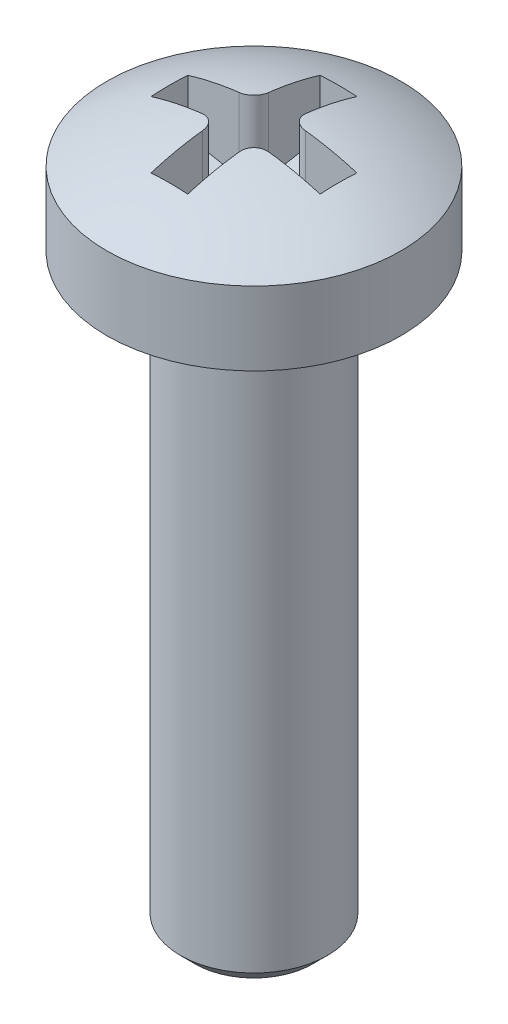
ISO-10303-21;
HEADER;
FILE_DESCRIPTION(('STEP AP214'),'2;1');
FILE_NAME('part.step','',(''),(''),'','','');
FILE_SCHEMA(('AUTOMOTIVE_DESIGN { 1 0 10303 214 1 1 1 1 }'));
ENDSEC;
DATA;
#1=APPLICATION_CONTEXT('core data for automotive mechanical design processes');
#2=APPLICATION_PROTOCOL_DEFINITION('international standard','automotive_design',2000,#1);
#3=PRODUCT_CONTEXT('',#1,'mechanical');
#4=PRODUCT('Part','Part','',(#3));
#5=PRODUCT_RELATED_PRODUCT_CATEGORY('part','',(#4));
#6=PRODUCT_DEFINITION_FORMATION('','',#4);
#7=PRODUCT_DEFINITION_CONTEXT('part definition',#1,'design');
#8=PRODUCT_DEFINITION('design','',#6,#7);
#9=PRODUCT_DEFINITION_SHAPE('','',#8);
#10=(LENGTH_UNIT() NAMED_UNIT(*) SI_UNIT(.MILLI.,.METRE.));
#11=(NAMED_UNIT(*) PLANE_ANGLE_UNIT() SI_UNIT($,.RADIAN.));
#12=(NAMED_UNIT(*) SI_UNIT($,.STERADIAN.) SOLID_ANGLE_UNIT());
#13=UNCERTAINTY_MEASURE_WITH_UNIT(LENGTH_MEASURE(1.E-05),#10,'distance_accuracy_value','');
#14=(GEOMETRIC_REPRESENTATION_CONTEXT(3) GLOBAL_UNCERTAINTY_ASSIGNED_CONTEXT((#13)) GLOBAL_UNIT_ASSIGNED_CONTEXT((#10,
#11,#12)) REPRESENTATION_CONTEXT('',''));
#15=CARTESIAN_POINT('',(0.,0.,0.));
#16=DIRECTION('',(0.,0.,1.));
#17=DIRECTION('',(1.,0.,0.));
#18=AXIS2_PLACEMENT_3D('',#15,#16,#17);
#19=CARTESIAN_POINT('',(2.,-16.,0.));
#20=DIRECTION('',(0.,1.,0.));
#21=DIRECTION('',(0.,0.,1.));
#22=AXIS2_PLACEMENT_3D('',#19,#20,#21);
#23=PLANE('',#22);
#24=CARTESIAN_POINT('',(0.,-16.,0.));
#25=DIRECTION('',(0.,1.,0.));
#26=DIRECTION('',(0.,0.,1.));
#27=AXIS2_PLACEMENT_3D('',#24,#25,#26);
#28=CIRCLE('',#27,1.60000000000001);
#29=CARTESIAN_POINT('',(0.,-16.,1.60000000000001));
#30=VERTEX_POINT('',#29);
#31=EDGE_CURVE('E11',#30,#30,#28,.F.);
#32=ORIENTED_EDGE('',*,*,#31,.T.);
#33=EDGE_LOOP('',(#32));
#34=FACE_BOUND('',#33,.T.);
#35=ADVANCED_FACE('F37',(#34),#23,.F.);
#36=CARTESIAN_POINT('',(0.,-4.72272727272728,0.));
#37=DIRECTION('',(0.,1.,0.));
#38=DIRECTION('',(1.,0.,0.));
#39=AXIS2_PLACEMENT_3D('',#36,#37,#38);
#40=SPHERICAL_SURFACE('',#39,7.82272727272728);
#41=CARTESIAN_POINT('',(0.5,-4.72272727272728,0.));
#42=DIRECTION('',(1.,0.,0.));
#43=DIRECTION('',(0.,0.,-1.));
#44=AXIS2_PLACEMENT_3D('',#41,#42,#43);
#45=CIRCLE('',#44,7.80673183755348);
#46=CARTESIAN_POINT('',(0.5,2.73750476008987,-2.3));
#47=VERTEX_POINT('',#46);
#48=CARTESIAN_POINT('',(0.5,3.03195273249996,-0.9));
#49=VERTEX_POINT('',#48);
#50=EDGE_CURVE('E195',#47,#49,#45,.T.);
#51=ORIENTED_EDGE('',*,*,#50,.T.);
#52=CARTESIAN_POINT('',(0.5,3.03195273249996,-0.9));
#53=CARTESIAN_POINT('',(0.499980445653111,3.03454133641409,-0.877715199489853));
#54=CARTESIAN_POINT('',(0.501861325410847,3.0369109081898,-0.855406290685576));
#55=CARTESIAN_POINT('',(0.509308944557218,3.04115309750786,-0.811373363194762));
#56=CARTESIAN_POINT('',(0.514874142284133,3.04302592244948,-0.789649103823202));
#57=CARTESIAN_POINT('',(0.529581237998282,3.04621922226135,-0.747382590966706));
#58=CARTESIAN_POINT('',(0.538725894104163,3.0475392695665,-0.726841263013532));
#59=CARTESIAN_POINT('',(0.560335395409864,3.04958563422558,-0.687561895208892));
#60=CARTESIAN_POINT('',(0.572799188800053,3.05031213937239,-0.668823286645484));
#61=CARTESIAN_POINT('',(0.600596407799792,3.05114682561896,-0.633816736919395));
#62=CARTESIAN_POINT('',(0.615908512897499,3.05125942358876,-0.617531968951503));
#63=CARTESIAN_POINT('',(0.649026593510928,3.0508747494218,-0.587736528915892));
#64=CARTESIAN_POINT('',(0.666832948845617,3.05037738431157,-0.57422628012003));
#65=CARTESIAN_POINT('',(0.704363578386314,3.04879030089852,-0.550401537052683));
#66=CARTESIAN_POINT('',(0.724081674108829,3.04770244181268,-0.540077170971166));
#67=CARTESIAN_POINT('',(0.764919862434989,3.04496752601447,-0.522847557382613));
#68=CARTESIAN_POINT('',(0.786039420133905,3.04332068167708,-0.515941013789886));
#69=CARTESIAN_POINT('',(0.822714805755103,3.04007942212771,-0.5072274099574));
#70=CARTESIAN_POINT('',(0.838074093965798,3.03861284502167,-0.504517057384848));
#71=CARTESIAN_POINT('',(0.868957976534767,3.0354499847468,-0.500903202638105));
#72=CARTESIAN_POINT('',(0.88448230264661,3.03375403356009,-0.499997118337815));
#73=CARTESIAN_POINT('',(0.9,3.03195273249996,-0.5));
#74=B_SPLINE_CURVE_WITH_KNOTS('',3,(#52,#53,#54,#55,#56,#57,#58,#59,#60,#61,#62,#63,#64,#65,#66,
#67,#68,#69,#70,#71,#72,#73),.UNSPECIFIED.,.F.,.F.,(4,2,2,2,2,2,2,2,2,2,4),(0.,
0.0672224170043276,0.134416723302517,0.201662907801201,0.26888780779591,0.335628401088124,
0.402379168562592,0.468920974876219,0.535437528240593,0.582332561709017,0.629160434341086),.UNSPECIFIED.);
#75=CARTESIAN_POINT('',(0.9,3.03195273249996,-0.5));
#76=VERTEX_POINT('',#75);
#77=EDGE_CURVE('E257',#49,#76,#74,.T.);
#78=ORIENTED_EDGE('',*,*,#77,.T.);
#79=CARTESIAN_POINT('',(0.,-4.72272727272728,-0.5));
#80=DIRECTION('',(0.,0.,-1.));
#81=DIRECTION('',(-1.,0.,0.));
#82=AXIS2_PLACEMENT_3D('',#79,#80,#81);
#83=CIRCLE('',#82,7.80673183755348);
#84=CARTESIAN_POINT('',(2.3,2.73750476008987,-0.5));
#85=VERTEX_POINT('',#84);
#86=EDGE_CURVE('E193',#76,#85,#83,.T.);
#87=ORIENTED_EDGE('',*,*,#86,.T.);
#88=CARTESIAN_POINT('',(2.3,-4.72272727272728,0.));
#89=DIRECTION('',(1.,0.,0.));
#90=DIRECTION('',(0.,0.,-1.));
#91=AXIS2_PLACEMENT_3D('',#88,#89,#90);
#92=CIRCLE('',#91,7.47696876972688);
#93=CARTESIAN_POINT('',(2.3,2.73750476008987,0.5));
#94=VERTEX_POINT('',#93);
#95=EDGE_CURVE('E170',#85,#94,#92,.T.);
#96=ORIENTED_EDGE('',*,*,#95,.T.);
#97=CARTESIAN_POINT('',(0.,-4.72272727272728,0.5));
#98=DIRECTION('',(0.,0.,1.));
#99=DIRECTION('',(1.,0.,0.));
#100=AXIS2_PLACEMENT_3D('',#97,#98,#99);
#101=CIRCLE('',#100,7.80673183755348);
#102=CARTESIAN_POINT('',(0.9,3.03195273249996,0.5));
#103=VERTEX_POINT('',#102);
#104=EDGE_CURVE('E219',#94,#103,#101,.T.);
#105=ORIENTED_EDGE('',*,*,#104,.T.);
#106=CARTESIAN_POINT('',(0.9,3.03195273249996,0.5));
#107=CARTESIAN_POINT('',(0.877715199489853,3.03454133641409,0.499980445653111));
#108=CARTESIAN_POINT('',(0.855406290685576,3.0369109081898,0.501861325410847));
#109=CARTESIAN_POINT('',(0.811373363194762,3.04115309750786,0.509308944557218));
#110=CARTESIAN_POINT('',(0.789649103823202,3.04302592244948,0.514874142284133));
#111=CARTESIAN_POINT('',(0.747382590966706,3.04621922226135,0.529581237998282));
#112=CARTESIAN_POINT('',(0.726841263013532,3.0475392695665,0.538725894104163));
#113=CARTESIAN_POINT('',(0.687561895208891,3.04958563422558,0.560335395409864));
#114=CARTESIAN_POINT('',(0.668823286645484,3.05031213937239,0.572799188800053));
#115=CARTESIAN_POINT('',(0.633816736919395,3.05114682561896,0.600596407799792));
#116=CARTESIAN_POINT('',(0.617531968951503,3.05125942358877,0.6159085128975));
#117=CARTESIAN_POINT('',(0.587736528915892,3.0508747494218,0.649026593510929));
#118=CARTESIAN_POINT('',(0.57422628012003,3.05037738431157,0.666832948845617));
#119=CARTESIAN_POINT('',(0.550401537052683,3.04879030089852,0.704363578386314));
#120=CARTESIAN_POINT('',(0.540077170971166,3.04770244181268,0.724081674108829));
#121=CARTESIAN_POINT('',(0.522847557382613,3.04496752601447,0.764919862434989));
#122=CARTESIAN_POINT('',(0.515941013789886,3.04332068167708,0.786039420133905));
#123=CARTESIAN_POINT('',(0.5072274099574,3.04007942212771,0.822714805755103));
#124=CARTESIAN_POINT('',(0.504517057384848,3.03861284502167,0.838074093965798));
#125=CARTESIAN_POINT('',(0.500903202638105,3.03544998474679,0.868957976534767));
#126=CARTESIAN_POINT('',(0.499997118337815,3.03375403356009,0.884482302646609));
#127=CARTESIAN_POINT('',(0.5,3.03195273249996,0.9));
#128=B_SPLINE_CURVE_WITH_KNOTS('',3,(#106,#107,#108,#109,#110,#111,#112,#113,#114,#115,#116,
#117,#118,#119,#120,#121,#122,#123,#124,#125,#126,#127),.UNSPECIFIED.,.F.,.F.,(4,2,2,2,2,2,2,2,
2,2,4),(0.,0.0672224170043276,0.134416723302517,0.201662907801201,0.268887807795911,
0.335628401088124,0.402379168562592,0.468920974876219,0.535437528240593,0.582332561709017,
0.629160434341086),.UNSPECIFIED.);
#129=CARTESIAN_POINT('',(0.5,3.03195273249996,0.9));
#130=VERTEX_POINT('',#129);
#131=EDGE_CURVE('E252',#103,#130,#128,.T.);
#132=ORIENTED_EDGE('',*,*,#131,.T.);
#133=CARTESIAN_POINT('',(0.5,-4.72272727272728,0.));
#134=DIRECTION('',(1.,0.,0.));
#135=DIRECTION('',(0.,0.,-1.));
#136=AXIS2_PLACEMENT_3D('',#133,#134,#135);
#137=CIRCLE('',#136,7.80673183755348);
#138=CARTESIAN_POINT('',(0.5,2.73750476008987,2.3));
#139=VERTEX_POINT('',#138);
#140=EDGE_CURVE('E217',#130,#139,#137,.T.);
#141=ORIENTED_EDGE('',*,*,#140,.T.);
#142=CARTESIAN_POINT('',(0.,-4.72272727272728,2.3));
#143=DIRECTION('',(0.,0.,1.));
#144=DIRECTION('',(1.,0.,0.));
#145=AXIS2_PLACEMENT_3D('',#142,#143,#144);
#146=CIRCLE('',#145,7.47696876972688);
#147=CARTESIAN_POINT('',(-0.5,2.73750476008987,2.3));
#148=VERTEX_POINT('',#147);
#149=EDGE_CURVE('E214',#139,#148,#146,.T.);
#150=ORIENTED_EDGE('',*,*,#149,.T.);
#151=CARTESIAN_POINT('',(-0.5,-4.72272727272728,0.));
#152=DIRECTION('',(-1.,0.,0.));
#153=DIRECTION('',(0.,0.,1.));
#154=AXIS2_PLACEMENT_3D('',#151,#152,#153);
#155=CIRCLE('',#154,7.80673183755348);
#156=CARTESIAN_POINT('',(-0.5,3.03195273249996,0.9));
#157=VERTEX_POINT('',#156);
#158=EDGE_CURVE('E211',#148,#157,#155,.T.);
#159=ORIENTED_EDGE('',*,*,#158,.T.);
#160=CARTESIAN_POINT('',(-0.5,3.03195273249996,0.9));
#161=CARTESIAN_POINT('',(-0.499980445653111,3.03454133641409,0.877715199489853));
#162=CARTESIAN_POINT('',(-0.501861325410847,3.0369109081898,0.855406290685576));
#163=CARTESIAN_POINT('',(-0.509308944557218,3.04115309750786,0.811373363194762));
#164=CARTESIAN_POINT('',(-0.514874142284133,3.04302592244948,0.789649103823202));
#165=CARTESIAN_POINT('',(-0.529581237998282,3.04621922226135,0.747382590966706));
#166=CARTESIAN_POINT('',(-0.538725894104163,3.0475392695665,0.726841263013532));
#167=CARTESIAN_POINT('',(-0.560335395409864,3.04958563422558,0.687561895208892));
#168=CARTESIAN_POINT('',(-0.572799188800053,3.05031213937239,0.668823286645484));
#169=CARTESIAN_POINT('',(-0.600596407799792,3.05114682561896,0.633816736919395));
#170=CARTESIAN_POINT('',(-0.6159085128975,3.05125942358876,0.617531968951503));
#171=CARTESIAN_POINT('',(-0.649026593510929,3.0508747494218,0.587736528915892));
#172=CARTESIAN_POINT('',(-0.666832948845617,3.05037738431157,0.57422628012003));
#173=CARTESIAN_POINT('',(-0.704363578386314,3.04879030089852,0.550401537052683));
#174=CARTESIAN_POINT('',(-0.724081674108829,3.04770244181268,0.540077170971166));
#175=CARTESIAN_POINT('',(-0.764919862434989,3.04496752601447,0.522847557382613));
#176=CARTESIAN_POINT('',(-0.786039420133905,3.04332068167708,0.515941013789887));
#177=CARTESIAN_POINT('',(-0.822714805755103,3.04007942212771,0.5072274099574));
#178=CARTESIAN_POINT('',(-0.838074093965798,3.03861284502167,0.504517057384848));
#179=CARTESIAN_POINT('',(-0.868957976534767,3.0354499847468,0.500903202638105));
#180=CARTESIAN_POINT('',(-0.88448230264661,3.03375403356009,0.499997118337815));
#181=CARTESIAN_POINT('',(-0.9,3.03195273249996,0.5));
#182=B_SPLINE_CURVE_WITH_KNOTS('',3,(#160,#161,#162,#163,#164,#165,#166,#167,#168,#169,#170,
#171,#172,#173,#174,#175,#176,#177,#178,#179,#180,#181),.UNSPECIFIED.,.F.,.F.,(4,2,2,2,2,2,2,2,
2,2,4),(0.,0.0672224170043276,0.134416723302517,0.201662907801201,0.26888780779591,
0.335628401088124,0.402379168562592,0.468920974876219,0.535437528240592,0.582332561709017,
0.629160434341086),.UNSPECIFIED.);
#183=CARTESIAN_POINT('',(-0.9,3.03195273249996,0.5));
#184=VERTEX_POINT('',#183);
#185=EDGE_CURVE('E231',#157,#184,#182,.T.);
#186=ORIENTED_EDGE('',*,*,#185,.T.);
#187=CARTESIAN_POINT('',(0.,-4.72272727272728,0.5));
#188=DIRECTION('',(0.,0.,1.));
#189=DIRECTION('',(1.,0.,0.));
#190=AXIS2_PLACEMENT_3D('',#187,#188,#189);
#191=CIRCLE('',#190,7.80673183755348);
#192=CARTESIAN_POINT('',(-2.3,2.73750476008987,0.5));
#193=VERTEX_POINT('',#192);
#194=EDGE_CURVE('E209',#184,#193,#191,.T.);
#195=ORIENTED_EDGE('',*,*,#194,.T.);
#196=CARTESIAN_POINT('',(-2.3,-4.72272727272728,0.));
#197=DIRECTION('',(-1.,0.,0.));
#198=DIRECTION('',(0.,0.,1.));
#199=AXIS2_PLACEMENT_3D('',#196,#197,#198);
#200=CIRCLE('',#199,7.47696876972688);
#201=CARTESIAN_POINT('',(-2.3,2.73750476008987,-0.5));
#202=VERTEX_POINT('',#201);
#203=EDGE_CURVE('E206',#193,#202,#200,.T.);
#204=ORIENTED_EDGE('',*,*,#203,.T.);
#205=CARTESIAN_POINT('',(0.,-4.72272727272728,-0.5));
#206=DIRECTION('',(0.,0.,-1.));
#207=DIRECTION('',(-1.,0.,0.));
#208=AXIS2_PLACEMENT_3D('',#205,#206,#207);
#209=CIRCLE('',#208,7.80673183755348);
#210=CARTESIAN_POINT('',(-0.9,3.03195273249996,-0.5));
#211=VERTEX_POINT('',#210);
#212=EDGE_CURVE('E203',#202,#211,#209,.T.);
#213=ORIENTED_EDGE('',*,*,#212,.T.);
#214=CARTESIAN_POINT('',(-0.9,3.03195273249996,-0.5));
#215=CARTESIAN_POINT('',(-0.877715199489853,3.03454133641409,-0.499980445653111));
#216=CARTESIAN_POINT('',(-0.855406290685576,3.0369109081898,-0.501861325410847));
#217=CARTESIAN_POINT('',(-0.811373363194762,3.04115309750786,-0.509308944557218));
#218=CARTESIAN_POINT('',(-0.789649103823202,3.04302592244948,-0.514874142284133));
#219=CARTESIAN_POINT('',(-0.747382590966706,3.04621922226135,-0.529581237998282));
#220=CARTESIAN_POINT('',(-0.726841263013532,3.0475392695665,-0.538725894104163));
#221=CARTESIAN_POINT('',(-0.687561895208892,3.04958563422558,-0.560335395409864));
#222=CARTESIAN_POINT('',(-0.668823286645484,3.05031213937239,-0.572799188800053));
#223=CARTESIAN_POINT('',(-0.633816736919395,3.05114682561896,-0.600596407799792));
#224=CARTESIAN_POINT('',(-0.617531968951503,3.05125942358877,-0.6159085128975));
#225=CARTESIAN_POINT('',(-0.587736528915892,3.0508747494218,-0.649026593510929));
#226=CARTESIAN_POINT('',(-0.57422628012003,3.05037738431157,-0.666832948845617));
#227=CARTESIAN_POINT('',(-0.550401537052683,3.04879030089852,-0.704363578386314));
#228=CARTESIAN_POINT('',(-0.540077170971166,3.04770244181268,-0.724081674108829));
#229=CARTESIAN_POINT('',(-0.522847557382613,3.04496752601447,-0.764919862434989));
#230=CARTESIAN_POINT('',(-0.515941013789887,3.04332068167708,-0.786039420133905));
#231=CARTESIAN_POINT('',(-0.5072274099574,3.04007942212771,-0.822714805755103));
#232=CARTESIAN_POINT('',(-0.504517057384848,3.03861284502167,-0.838074093965798));
#233=CARTESIAN_POINT('',(-0.500903202638105,3.03544998474679,-0.868957976534767));
#234=CARTESIAN_POINT('',(-0.499997118337815,3.03375403356009,-0.88448230264661));
#235=CARTESIAN_POINT('',(-0.5,3.03195273249996,-0.9));
#236=B_SPLINE_CURVE_WITH_KNOTS('',3,(#214,#215,#216,#217,#218,#219,#220,#221,#222,#223,#224,
#225,#226,#227,#228,#229,#230,#231,#232,#233,#234,#235),.UNSPECIFIED.,.F.,.F.,(4,2,2,2,2,2,2,2,
2,2,4),(0.,0.0672224170043276,0.134416723302517,0.201662907801201,0.268887807795911,
0.335628401088124,0.402379168562592,0.468920974876219,0.535437528240593,0.582332561709018,
0.629160434341086),.UNSPECIFIED.);
#237=CARTESIAN_POINT('',(-0.5,3.03195273249996,-0.9));
#238=VERTEX_POINT('',#237);
#239=EDGE_CURVE('E225',#211,#238,#236,.T.);
#240=ORIENTED_EDGE('',*,*,#239,.T.);
#241=CARTESIAN_POINT('',(-0.5,-4.72272727272728,0.));
#242=DIRECTION('',(-1.,0.,0.));
#243=DIRECTION('',(0.,0.,1.));
#244=AXIS2_PLACEMENT_3D('',#241,#242,#243);
#245=CIRCLE('',#244,7.80673183755348);
#246=CARTESIAN_POINT('',(-0.5,2.73750476008987,-2.3));
#247=VERTEX_POINT('',#246);
#248=EDGE_CURVE('E201',#238,#247,#245,.T.);
#249=ORIENTED_EDGE('',*,*,#248,.T.);
#250=CARTESIAN_POINT('',(0.,-4.72272727272728,-2.3));
#251=DIRECTION('',(0.,0.,-1.));
#252=DIRECTION('',(-1.,0.,0.));
#253=AXIS2_PLACEMENT_3D('',#250,#251,#252);
#254=CIRCLE('',#253,7.47696876972688);
#255=EDGE_CURVE('E198',#247,#47,#254,.T.);
#256=ORIENTED_EDGE('',*,*,#255,.T.);
#257=EDGE_LOOP('',(#51,#78,#87,#96,#105,#132,#141,#150,#159,#186,#195,#204,#213,#240,#249,#256));
#258=FACE_BOUND('',#257,.T.);
#259=CARTESIAN_POINT('',(0.,2.,0.));
#260=DIRECTION('',(0.,1.,0.));
#261=DIRECTION('',(0.,0.,1.));
#262=AXIS2_PLACEMENT_3D('',#259,#260,#261);
#263=CIRCLE('',#262,4.);
#264=CARTESIAN_POINT('',(0.,2.,4.));
#265=VERTEX_POINT('',#264);
#266=EDGE_CURVE('E189',#265,#265,#263,.T.);
#267=ORIENTED_EDGE('',*,*,#266,.T.);
#268=EDGE_LOOP('',(#267));
#269=FACE_BOUND('',#268,.T.);
#270=ADVANCED_FACE('F239',(#258,#269),#40,.T.);
#271=CARTESIAN_POINT('',(0.,3.1,0.));
#272=DIRECTION('',(0.,1.,0.));
#273=DIRECTION('',(0.,0.,1.));
#274=AXIS2_PLACEMENT_3D('',#271,#272,#273);
#275=CYLINDRICAL_SURFACE('',#274,4.);
#276=ORIENTED_EDGE('',*,*,#266,.F.);
#277=EDGE_LOOP('',(#276));
#278=FACE_BOUND('',#277,.T.);
#279=CARTESIAN_POINT('',(0.,0.,0.));
#280=DIRECTION('',(0.,1.,0.));
#281=DIRECTION('',(0.,0.,1.));
#282=AXIS2_PLACEMENT_3D('',#279,#280,#281);
#283=CIRCLE('',#282,4.);
#284=CARTESIAN_POINT('',(0.,0.,4.));
#285=VERTEX_POINT('',#284);
#286=EDGE_CURVE('E181',#285,#285,#283,.T.);
#287=ORIENTED_EDGE('',*,*,#286,.T.);
#288=EDGE_LOOP('',(#287));
#289=FACE_BOUND('',#288,.T.);
#290=ADVANCED_FACE('F244',(#278,#289),#275,.T.);
#291=CARTESIAN_POINT('',(4.,0.,0.));
#292=DIRECTION('',(0.,1.,0.));
#293=DIRECTION('',(0.,0.,1.));
#294=AXIS2_PLACEMENT_3D('',#291,#292,#293);
#295=PLANE('',#294);
#296=ORIENTED_EDGE('',*,*,#286,.F.);
#297=EDGE_LOOP('',(#296));
#298=FACE_BOUND('',#297,.T.);
#299=CARTESIAN_POINT('',(0.,0.,0.));
#300=DIRECTION('',(0.,1.,0.));
#301=DIRECTION('',(0.,0.,1.));
#302=AXIS2_PLACEMENT_3D('',#299,#300,#301);
#303=CIRCLE('',#302,2.);
#304=CARTESIAN_POINT('',(0.,0.,2.));
#305=VERTEX_POINT('',#304);
#306=EDGE_CURVE('E178',#305,#305,#303,.T.);
#307=ORIENTED_EDGE('',*,*,#306,.T.);
#308=EDGE_LOOP('',(#307));
#309=FACE_BOUND('',#308,.T.);
#310=ADVANCED_FACE('F331',(#298,#309),#295,.F.);
#311=CARTESIAN_POINT('',(0.,3.1,0.));
#312=DIRECTION('',(0.,1.,0.));
#313=DIRECTION('',(0.,0.,1.));
#314=AXIS2_PLACEMENT_3D('',#311,#312,#313);
#315=CYLINDRICAL_SURFACE('',#314,2.);
#316=CARTESIAN_POINT('',(0.,-15.6,0.));
#317=DIRECTION('',(0.,1.,0.));
#318=DIRECTION('',(0.,0.,1.));
#319=AXIS2_PLACEMENT_3D('',#316,#317,#318);
#320=CIRCLE('',#319,2.);
#321=CARTESIAN_POINT('',(0.,-15.6,2.));
#322=VERTEX_POINT('',#321);
#323=EDGE_CURVE('E45',#322,#322,#320,.T.);
#324=ORIENTED_EDGE('',*,*,#323,.T.);
#325=EDGE_LOOP('',(#324));
#326=FACE_BOUND('',#325,.T.);
#327=ORIENTED_EDGE('',*,*,#306,.F.);
#328=EDGE_LOOP('',(#327));
#329=FACE_BOUND('',#328,.T.);
#330=ADVANCED_FACE('F303',(#326,#329),#315,.T.);
#331=CARTESIAN_POINT('',(0.5,-16.001,0.5));
#332=DIRECTION('',(0.,0.,1.));
#333=DIRECTION('',(1.,0.,0.));
#334=AXIS2_PLACEMENT_3D('',#331,#332,#333);
#335=PLANE('',#334);
#336=CARTESIAN_POINT('',(0.,9.49999999999998,0.5));
#337=DIRECTION('',(0.,0.,1.));
#338=DIRECTION('',(1.,0.,0.));
#339=AXIS2_PLACEMENT_3D('',#336,#337,#338);
#340=CIRCLE('',#339,8.48528137423855);
#341=CARTESIAN_POINT('',(2.3,1.3323810079069,0.5));
#342=VERTEX_POINT('',#341);
#343=CARTESIAN_POINT('',(0.9,1.06258333374486,0.5));
#344=VERTEX_POINT('',#343);
#345=EDGE_CURVE('E176',#342,#344,#340,.F.);
#346=ORIENTED_EDGE('',*,*,#345,.T.);
#347=DIRECTION('',(0.,1.,0.));
#348=VECTOR('',#347,1.);
#349=CARTESIAN_POINT('',(0.9,-16.001,0.5));
#350=LINE('',#349,#348);
#351=EDGE_CURVE('E556',#344,#103,#350,.T.);
#352=ORIENTED_EDGE('',*,*,#351,.T.);
#353=ORIENTED_EDGE('',*,*,#104,.F.);
#354=DIRECTION('',(0.,1.,0.));
#355=VECTOR('',#354,1.);
#356=CARTESIAN_POINT('',(2.3,-16.001,0.5));
#357=LINE('',#356,#355);
#358=EDGE_CURVE('E172',#342,#94,#357,.T.);
#359=ORIENTED_EDGE('',*,*,#358,.F.);
#360=EDGE_LOOP('',(#346,#352,#353,#359));
#361=FACE_BOUND('',#360,.T.);
#362=ADVANCED_FACE('F344',(#361),#335,.F.);
#363=CARTESIAN_POINT('',(0.5,-16.001,0.5));
#364=DIRECTION('',(1.,0.,0.));
#365=DIRECTION('',(0.,0.,-1.));
#366=AXIS2_PLACEMENT_3D('',#363,#364,#365);
#367=PLANE('',#366);
#368=ORIENTED_EDGE('',*,*,#140,.F.);
#369=DIRECTION('',(0.,1.,0.));
#370=VECTOR('',#369,1.);
#371=CARTESIAN_POINT('',(0.5,-16.001,0.9));
#372=LINE('',#371,#370);
#373=CARTESIAN_POINT('',(0.5,1.06258333374486,0.9));
#374=VERTEX_POINT('',#373);
#375=EDGE_CURVE('E554',#130,#374,#372,.F.);
#376=ORIENTED_EDGE('',*,*,#375,.T.);
#377=CARTESIAN_POINT('',(0.5,9.49999999999998,0.));
#378=DIRECTION('',(1.,0.,0.));
#379=DIRECTION('',(0.,0.,-1.));
#380=AXIS2_PLACEMENT_3D('',#377,#378,#379);
#381=CIRCLE('',#380,8.48528137423855);
#382=CARTESIAN_POINT('',(0.5,1.3323810079069,2.3));
#383=VERTEX_POINT('',#382);
#384=EDGE_CURVE('E183',#374,#383,#381,.F.);
#385=ORIENTED_EDGE('',*,*,#384,.T.);
#386=DIRECTION('',(0.,1.,0.));
#387=VECTOR('',#386,1.);
#388=CARTESIAN_POINT('',(0.5,-16.001,2.3));
#389=LINE('',#388,#387);
#390=EDGE_CURVE('E162',#383,#139,#389,.T.);
#391=ORIENTED_EDGE('',*,*,#390,.T.);
#392=EDGE_LOOP('',(#368,#376,#385,#391));
#393=FACE_BOUND('',#392,.T.);
#394=ADVANCED_FACE('F292',(#393),#367,.F.);
#395=CARTESIAN_POINT('',(-0.5,-16.001,2.3));
#396=DIRECTION('',(0.,0.,1.));
#397=DIRECTION('',(1.,0.,0.));
#398=AXIS2_PLACEMENT_3D('',#395,#396,#397);
#399=PLANE('',#398);
#400=ORIENTED_EDGE('',*,*,#390,.F.);
#401=CARTESIAN_POINT('',(0.,9.49999999999998,2.3));
#402=DIRECTION('',(0.,0.,1.));
#403=DIRECTION('',(1.,0.,0.));
#404=AXIS2_PLACEMENT_3D('',#401,#402,#403);
#405=CIRCLE('',#404,8.18290901819149);
#406=CARTESIAN_POINT('',(-0.5,1.3323810079069,2.3));
#407=VERTEX_POINT('',#406);
#408=EDGE_CURVE('E518',#383,#407,#405,.F.);
#409=ORIENTED_EDGE('',*,*,#408,.T.);
#410=DIRECTION('',(0.,1.,0.));
#411=VECTOR('',#410,1.);
#412=CARTESIAN_POINT('',(-0.5,-16.001,2.3));
#413=LINE('',#412,#411);
#414=EDGE_CURVE('E517',#407,#148,#413,.T.);
#415=ORIENTED_EDGE('',*,*,#414,.T.);
#416=ORIENTED_EDGE('',*,*,#149,.F.);
#417=EDGE_LOOP('',(#400,#409,#415,#416));
#418=FACE_BOUND('',#417,.T.);
#419=ADVANCED_FACE('F357',(#418),#399,.F.);
#420=CARTESIAN_POINT('',(-0.5,-16.001,0.5));
#421=DIRECTION('',(-1.,0.,0.));
#422=DIRECTION('',(0.,0.,1.));
#423=AXIS2_PLACEMENT_3D('',#420,#421,#422);
#424=PLANE('',#423);
#425=CARTESIAN_POINT('',(-0.5,9.49999999999998,0.));
#426=DIRECTION('',(-1.,0.,0.));
#427=DIRECTION('',(0.,0.,1.));
#428=AXIS2_PLACEMENT_3D('',#425,#426,#427);
#429=CIRCLE('',#428,8.48528137423855);
#430=CARTESIAN_POINT('',(-0.5,1.06258333374486,0.9));
#431=VERTEX_POINT('',#430);
#432=EDGE_CURVE('E512',#407,#431,#429,.F.);
#433=ORIENTED_EDGE('',*,*,#432,.T.);
#434=DIRECTION('',(0.,1.,0.));
#435=VECTOR('',#434,1.);
#436=CARTESIAN_POINT('',(-0.5,-16.001,0.9));
#437=LINE('',#436,#435);
#438=EDGE_CURVE('E507',#431,#157,#437,.T.);
#439=ORIENTED_EDGE('',*,*,#438,.T.);
#440=ORIENTED_EDGE('',*,*,#158,.F.);
#441=ORIENTED_EDGE('',*,*,#414,.F.);
#442=EDGE_LOOP('',(#433,#439,#440,#441));
#443=FACE_BOUND('',#442,.T.);
#444=ADVANCED_FACE('F364',(#443),#424,.F.);
#445=CARTESIAN_POINT('',(-2.3,-16.001,0.5));
#446=DIRECTION('',(0.,0.,1.));
#447=DIRECTION('',(1.,0.,0.));
#448=AXIS2_PLACEMENT_3D('',#445,#446,#447);
#449=PLANE('',#448);
#450=ORIENTED_EDGE('',*,*,#194,.F.);
#451=DIRECTION('',(0.,1.,0.));
#452=VECTOR('',#451,1.);
#453=CARTESIAN_POINT('',(-0.9,-16.001,0.5));
#454=LINE('',#453,#452);
#455=CARTESIAN_POINT('',(-0.9,1.06258333374486,0.5));
#456=VERTEX_POINT('',#455);
#457=EDGE_CURVE('E505',#184,#456,#454,.F.);
#458=ORIENTED_EDGE('',*,*,#457,.T.);
#459=CARTESIAN_POINT('',(0.,9.49999999999998,0.5));
#460=DIRECTION('',(0.,0.,1.));
#461=DIRECTION('',(1.,0.,0.));
#462=AXIS2_PLACEMENT_3D('',#459,#460,#461);
#463=CIRCLE('',#462,8.48528137423855);
#464=CARTESIAN_POINT('',(-2.3,1.3323810079069,0.5));
#465=VERTEX_POINT('',#464);
#466=EDGE_CURVE('E515',#456,#465,#463,.F.);
#467=ORIENTED_EDGE('',*,*,#466,.T.);
#468=DIRECTION('',(0.,1.,0.));
#469=VECTOR('',#468,1.);
#470=CARTESIAN_POINT('',(-2.3,-16.001,0.5));
#471=LINE('',#470,#469);
#472=EDGE_CURVE('E529',#465,#193,#471,.T.);
#473=ORIENTED_EDGE('',*,*,#472,.T.);
#474=EDGE_LOOP('',(#450,#458,#467,#473));
#475=FACE_BOUND('',#474,.T.);
#476=ADVANCED_FACE('F371',(#475),#449,.F.);
#477=CARTESIAN_POINT('',(-2.3,-16.001,-0.5));
#478=DIRECTION('',(-1.,0.,0.));
#479=DIRECTION('',(0.,0.,1.));
#480=AXIS2_PLACEMENT_3D('',#477,#478,#479);
#481=PLANE('',#480);
#482=ORIENTED_EDGE('',*,*,#472,.F.);
#483=CARTESIAN_POINT('',(-2.3,9.49999999999998,0.));
#484=DIRECTION('',(-1.,0.,0.));
#485=DIRECTION('',(0.,0.,1.));
#486=AXIS2_PLACEMENT_3D('',#483,#484,#485);
#487=CIRCLE('',#486,8.18290901819149);
#488=CARTESIAN_POINT('',(-2.3,1.3323810079069,-0.5));
#489=VERTEX_POINT('',#488);
#490=EDGE_CURVE('E521',#465,#489,#487,.F.);
#491=ORIENTED_EDGE('',*,*,#490,.T.);
#492=DIRECTION('',(0.,1.,0.));
#493=VECTOR('',#492,1.);
#494=CARTESIAN_POINT('',(-2.3,-16.001,-0.5));
#495=LINE('',#494,#493);
#496=EDGE_CURVE('E532',#489,#202,#495,.T.);
#497=ORIENTED_EDGE('',*,*,#496,.T.);
#498=ORIENTED_EDGE('',*,*,#203,.F.);
#499=EDGE_LOOP('',(#482,#491,#497,#498));
#500=FACE_BOUND('',#499,.T.);
#501=ADVANCED_FACE('F379',(#500),#481,.F.);
#502=CARTESIAN_POINT('',(-2.3,-16.001,-0.5));
#503=DIRECTION('',(0.,0.,-1.));
#504=DIRECTION('',(-1.,0.,0.));
#505=AXIS2_PLACEMENT_3D('',#502,#503,#504);
#506=PLANE('',#505);
#507=CARTESIAN_POINT('',(0.,9.49999999999998,-0.5));
#508=DIRECTION('',(0.,0.,-1.));
#509=DIRECTION('',(-1.,0.,0.));
#510=AXIS2_PLACEMENT_3D('',#507,#508,#509);
#511=CIRCLE('',#510,8.48528137423855);
#512=CARTESIAN_POINT('',(-0.9,1.06258333374486,-0.5));
#513=VERTEX_POINT('',#512);
#514=EDGE_CURVE('E564',#489,#513,#511,.F.);
#515=ORIENTED_EDGE('',*,*,#514,.T.);
#516=DIRECTION('',(0.,1.,0.));
#517=VECTOR('',#516,1.);
#518=CARTESIAN_POINT('',(-0.9,-16.001,-0.5));
#519=LINE('',#518,#517);
#520=EDGE_CURVE('E549',#513,#211,#519,.T.);
#521=ORIENTED_EDGE('',*,*,#520,.T.);
#522=ORIENTED_EDGE('',*,*,#212,.F.);
#523=ORIENTED_EDGE('',*,*,#496,.F.);
#524=EDGE_LOOP('',(#515,#521,#522,#523));
#525=FACE_BOUND('',#524,.T.);
#526=ADVANCED_FACE('F387',(#525),#506,.F.);
#527=CARTESIAN_POINT('',(-0.5,-16.001,-2.3));
#528=DIRECTION('',(-1.,0.,0.));
#529=DIRECTION('',(0.,0.,1.));
#530=AXIS2_PLACEMENT_3D('',#527,#528,#529);
#531=PLANE('',#530);
#532=ORIENTED_EDGE('',*,*,#248,.F.);
#533=DIRECTION('',(0.,1.,0.));
#534=VECTOR('',#533,1.);
#535=CARTESIAN_POINT('',(-0.5,-16.001,-0.9));
#536=LINE('',#535,#534);
#537=CARTESIAN_POINT('',(-0.5,1.06258333374486,-0.9));
#538=VERTEX_POINT('',#537);
#539=EDGE_CURVE('E52',#238,#538,#536,.F.);
#540=ORIENTED_EDGE('',*,*,#539,.T.);
#541=CARTESIAN_POINT('',(-0.5,9.49999999999998,0.));
#542=DIRECTION('',(-1.,0.,0.));
#543=DIRECTION('',(0.,0.,1.));
#544=AXIS2_PLACEMENT_3D('',#541,#542,#543);
#545=CIRCLE('',#544,8.48528137423855);
#546=CARTESIAN_POINT('',(-0.5,1.3323810079069,-2.3));
#547=VERTEX_POINT('',#546);
#548=EDGE_CURVE('E560',#538,#547,#545,.F.);
#549=ORIENTED_EDGE('',*,*,#548,.T.);
#550=DIRECTION('',(0.,1.,0.));
#551=VECTOR('',#550,1.);
#552=CARTESIAN_POINT('',(-0.5,-16.001,-2.3));
#553=LINE('',#552,#551);
#554=EDGE_CURVE('E535',#547,#247,#553,.T.);
#555=ORIENTED_EDGE('',*,*,#554,.T.);
#556=EDGE_LOOP('',(#532,#540,#549,#555));
#557=FACE_BOUND('',#556,.T.);
#558=ADVANCED_FACE('F395',(#557),#531,.F.);
#559=CARTESIAN_POINT('',(-0.5,-16.001,-2.3));
#560=DIRECTION('',(0.,0.,-1.));
#561=DIRECTION('',(-1.,0.,0.));
#562=AXIS2_PLACEMENT_3D('',#559,#560,#561);
#563=PLANE('',#562);
#564=ORIENTED_EDGE('',*,*,#554,.F.);
#565=CARTESIAN_POINT('',(0.,9.49999999999998,-2.3));
#566=DIRECTION('',(0.,0.,-1.));
#567=DIRECTION('',(-1.,0.,0.));
#568=AXIS2_PLACEMENT_3D('',#565,#566,#567);
#569=CIRCLE('',#568,8.18290901819149);
#570=CARTESIAN_POINT('',(0.5,1.3323810079069,-2.3));
#571=VERTEX_POINT('',#570);
#572=EDGE_CURVE('E543',#547,#571,#569,.F.);
#573=ORIENTED_EDGE('',*,*,#572,.T.);
#574=DIRECTION('',(0.,1.,0.));
#575=VECTOR('',#574,1.);
#576=CARTESIAN_POINT('',(0.5,-16.001,-2.3));
#577=LINE('',#576,#575);
#578=EDGE_CURVE('E171',#571,#47,#577,.T.);
#579=ORIENTED_EDGE('',*,*,#578,.T.);
#580=ORIENTED_EDGE('',*,*,#255,.F.);
#581=EDGE_LOOP('',(#564,#573,#579,#580));
#582=FACE_BOUND('',#581,.T.);
#583=ADVANCED_FACE('F403',(#582),#563,.F.);
#584=CARTESIAN_POINT('',(0.5,-16.001,-2.3));
#585=DIRECTION('',(1.,0.,0.));
#586=DIRECTION('',(0.,0.,-1.));
#587=AXIS2_PLACEMENT_3D('',#584,#585,#586);
#588=PLANE('',#587);
#589=CARTESIAN_POINT('',(0.5,9.49999999999998,0.));
#590=DIRECTION('',(1.,0.,0.));
#591=DIRECTION('',(0.,0.,-1.));
#592=AXIS2_PLACEMENT_3D('',#589,#590,#591);
#593=CIRCLE('',#592,8.48528137423855);
#594=CARTESIAN_POINT('',(0.5,1.06258333374486,-0.9));
#595=VERTEX_POINT('',#594);
#596=EDGE_CURVE('E161',#571,#595,#593,.F.);
#597=ORIENTED_EDGE('',*,*,#596,.T.);
#598=DIRECTION('',(0.,1.,0.));
#599=VECTOR('',#598,1.);
#600=CARTESIAN_POINT('',(0.5,-16.001,-0.9));
#601=LINE('',#600,#599);
#602=EDGE_CURVE('E222',#595,#49,#601,.T.);
#603=ORIENTED_EDGE('',*,*,#602,.T.);
#604=ORIENTED_EDGE('',*,*,#50,.F.);
#605=ORIENTED_EDGE('',*,*,#578,.F.);
#606=EDGE_LOOP('',(#597,#603,#604,#605));
#607=FACE_BOUND('',#606,.T.);
#608=ADVANCED_FACE('F410',(#607),#588,.F.);
#609=CARTESIAN_POINT('',(0.5,-16.001,-0.5));
#610=DIRECTION('',(0.,0.,-1.));
#611=DIRECTION('',(-1.,0.,0.));
#612=AXIS2_PLACEMENT_3D('',#609,#610,#611);
#613=PLANE('',#612);
#614=ORIENTED_EDGE('',*,*,#86,.F.);
#615=DIRECTION('',(0.,1.,0.));
#616=VECTOR('',#615,1.);
#617=CARTESIAN_POINT('',(0.9,-16.001,-0.5));
#618=LINE('',#617,#616);
#619=CARTESIAN_POINT('',(0.9,1.06258333374486,-0.5));
#620=VERTEX_POINT('',#619);
#621=EDGE_CURVE('E158',#76,#620,#618,.F.);
#622=ORIENTED_EDGE('',*,*,#621,.T.);
#623=CARTESIAN_POINT('',(0.,9.49999999999998,-0.5));
#624=DIRECTION('',(0.,0.,-1.));
#625=DIRECTION('',(-1.,0.,0.));
#626=AXIS2_PLACEMENT_3D('',#623,#624,#625);
#627=CIRCLE('',#626,8.48528137423855);
#628=CARTESIAN_POINT('',(2.3,1.3323810079069,-0.5));
#629=VERTEX_POINT('',#628);
#630=EDGE_CURVE('E152',#620,#629,#627,.F.);
#631=ORIENTED_EDGE('',*,*,#630,.T.);
#632=DIRECTION('',(0.,1.,0.));
#633=VECTOR('',#632,1.);
#634=CARTESIAN_POINT('',(2.3,-16.001,-0.5));
#635=LINE('',#634,#633);
#636=EDGE_CURVE('E156',#629,#85,#635,.T.);
#637=ORIENTED_EDGE('',*,*,#636,.T.);
#638=EDGE_LOOP('',(#614,#622,#631,#637));
#639=FACE_BOUND('',#638,.T.);
#640=ADVANCED_FACE('F155',(#639),#613,.F.);
#641=CARTESIAN_POINT('',(2.3,-16.001,-0.5));
#642=DIRECTION('',(1.,0.,0.));
#643=DIRECTION('',(0.,0.,-1.));
#644=AXIS2_PLACEMENT_3D('',#641,#642,#643);
#645=PLANE('',#644);
#646=ORIENTED_EDGE('',*,*,#636,.F.);
#647=CARTESIAN_POINT('',(2.3,9.49999999999998,0.));
#648=DIRECTION('',(1.,0.,0.));
#649=DIRECTION('',(0.,0.,-1.));
#650=AXIS2_PLACEMENT_3D('',#647,#648,#649);
#651=CIRCLE('',#650,8.18290901819149);
#652=EDGE_CURVE('E167',#629,#342,#651,.F.);
#653=ORIENTED_EDGE('',*,*,#652,.T.);
#654=ORIENTED_EDGE('',*,*,#358,.T.);
#655=ORIENTED_EDGE('',*,*,#95,.F.);
#656=EDGE_LOOP('',(#646,#653,#654,#655));
#657=FACE_BOUND('',#656,.T.);
#658=ADVANCED_FACE('F166',(#657),#645,.F.);
#659=CARTESIAN_POINT('',(0.,9.49999999999998,0.));
#660=DIRECTION('',(0.,1.,0.));
#661=DIRECTION('',(1.,0.,0.));
#662=AXIS2_PLACEMENT_3D('',#659,#660,#661);
#663=SPHERICAL_SURFACE('',#662,8.49999999999998);
#664=ORIENTED_EDGE('',*,*,#345,.F.);
#665=ORIENTED_EDGE('',*,*,#652,.F.);
#666=ORIENTED_EDGE('',*,*,#630,.F.);
#667=CARTESIAN_POINT('',(0.9,1.06258333374486,-0.5));
#668=CARTESIAN_POINT('',(0.877681895176581,1.06020064583187,-0.499980506377996));
#669=CARTESIAN_POINT('',(0.855344205727362,1.0580201488652,-0.501866869905914));
#670=CARTESIAN_POINT('',(0.811264196369215,1.05411756501269,-0.509332340473144));
#671=CARTESIAN_POINT('',(0.78952159882242,1.05239526097159,-0.514909693823375));
#672=CARTESIAN_POINT('',(0.747228556255667,1.04945966047884,-0.529643735623788));
#673=CARTESIAN_POINT('',(0.726678990033897,1.04824673524169,-0.538803025087882));
#674=CARTESIAN_POINT('',(0.687389852539137,1.04636746374655,-0.560442280349619));
#675=CARTESIAN_POINT('',(0.668649749482246,1.04570095646757,-0.572921266446781));
#676=CARTESIAN_POINT('',(0.633625729643449,1.04493649451643,-0.600763861630353));
#677=CARTESIAN_POINT('',(0.617327507926939,1.04483509156346,-0.616109383561911));
#678=CARTESIAN_POINT('',(0.587514637710959,1.04519463942213,-0.649299998886555));
#679=CARTESIAN_POINT('',(0.574000432084661,1.04565567962496,-0.667145489209941));
#680=CARTESIAN_POINT('',(0.55017165377276,1.04712438551599,-0.704769667803527));
#681=CARTESIAN_POINT('',(0.539848822620757,1.04813062146146,-0.724543189195622));
#682=CARTESIAN_POINT('',(0.522637980126425,1.05065941614313,-0.765498290560969));
#683=CARTESIAN_POINT('',(0.515748559609182,1.05218176262027,-0.78667928881133));
#684=CARTESIAN_POINT('',(0.507116958212197,1.05516459963325,-0.823303350164225));
#685=CARTESIAN_POINT('',(0.504448298653858,1.05650461680506,-0.838544928463922));
#686=CARTESIAN_POINT('',(0.500889732891837,1.05939256924764,-0.869192646434852));
#687=CARTESIAN_POINT('',(0.499997287547255,1.06094020433808,-0.884598519500552));
#688=CARTESIAN_POINT('',(0.5,1.06258333374486,-0.9));
#689=B_SPLINE_CURVE_WITH_KNOTS('',3,(#667,#668,#669,#670,#671,#672,#673,#674,#675,#676,#677,
#678,#679,#680,#681,#682,#683,#684,#685,#686,#687,#688),.UNSPECIFIED.,.F.,.F.,(4,2,2,2,2,2,2,2,
2,2,4),(0.,0.0672520458092346,0.134472161271656,0.201741179358209,0.268990367163335,
0.33582874565086,0.402677748396607,0.469352286257207,0.535999436300152,0.582495090258099,
0.628924229684279),.UNSPECIFIED.);
#690=EDGE_CURVE('E280',#620,#595,#689,.T.);
#691=ORIENTED_EDGE('',*,*,#690,.T.);
#692=ORIENTED_EDGE('',*,*,#596,.F.);
#693=ORIENTED_EDGE('',*,*,#572,.F.);
#694=ORIENTED_EDGE('',*,*,#548,.F.);
#695=CARTESIAN_POINT('',(-0.5,1.06258333374486,-0.9));
#696=CARTESIAN_POINT('',(-0.499980506377996,1.06020064583187,-0.877681895176581));
#697=CARTESIAN_POINT('',(-0.501866869905914,1.0580201488652,-0.855344205727362));
#698=CARTESIAN_POINT('',(-0.509332340473144,1.05411756501269,-0.811264196369215));
#699=CARTESIAN_POINT('',(-0.514909693823375,1.05239526097159,-0.789521598822421));
#700=CARTESIAN_POINT('',(-0.529643735623788,1.04945966047884,-0.747228556255667));
#701=CARTESIAN_POINT('',(-0.538803025087882,1.04824673524169,-0.726678990033897));
#702=CARTESIAN_POINT('',(-0.56044228034962,1.04636746374655,-0.687389852539137));
#703=CARTESIAN_POINT('',(-0.572921266446781,1.04570095646757,-0.668649749482246));
#704=CARTESIAN_POINT('',(-0.600763861630353,1.04493649451643,-0.633625729643449));
#705=CARTESIAN_POINT('',(-0.616109383561911,1.04483509156346,-0.617327507926939));
#706=CARTESIAN_POINT('',(-0.649299998886555,1.04519463942213,-0.58751463771096));
#707=CARTESIAN_POINT('',(-0.667145489209941,1.04565567962496,-0.574000432084661));
#708=CARTESIAN_POINT('',(-0.704769667803527,1.04712438551599,-0.550171653772761));
#709=CARTESIAN_POINT('',(-0.724543189195622,1.04813062146146,-0.539848822620758));
#710=CARTESIAN_POINT('',(-0.765498290560969,1.05065941614313,-0.522637980126425));
#711=CARTESIAN_POINT('',(-0.78667928881133,1.05218176262027,-0.515748559609182));
#712=CARTESIAN_POINT('',(-0.823303350164225,1.05516459963325,-0.507116958212197));
#713=CARTESIAN_POINT('',(-0.838544928463922,1.05650461680506,-0.504448298653858));
#714=CARTESIAN_POINT('',(-0.869192646434852,1.05939256924764,-0.500889732891837));
#715=CARTESIAN_POINT('',(-0.884598519500552,1.06094020433808,-0.499997287547255));
#716=CARTESIAN_POINT('',(-0.9,1.06258333374486,-0.5));
#717=B_SPLINE_CURVE_WITH_KNOTS('',3,(#695,#696,#697,#698,#699,#700,#701,#702,#703,#704,#705,
#706,#707,#708,#709,#710,#711,#712,#713,#714,#715,#716),.UNSPECIFIED.,.F.,.F.,(4,2,2,2,2,2,2,2,
2,2,4),(0.,0.0672520458092345,0.134472161271656,0.201741179358209,0.268990367163335,
0.33582874565086,0.402677748396607,0.469352286257207,0.535999436300152,0.582495090258099,
0.628924229684279),.UNSPECIFIED.);
#718=EDGE_CURVE('E59',#538,#513,#717,.T.);
#719=ORIENTED_EDGE('',*,*,#718,.T.);
#720=ORIENTED_EDGE('',*,*,#514,.F.);
#721=ORIENTED_EDGE('',*,*,#490,.F.);
#722=ORIENTED_EDGE('',*,*,#466,.F.);
#723=CARTESIAN_POINT('',(-0.9,1.06258333374486,0.5));
#724=CARTESIAN_POINT('',(-0.877681895176581,1.06020064583187,0.499980506377996));
#725=CARTESIAN_POINT('',(-0.855344205727362,1.0580201488652,0.501866869905914));
#726=CARTESIAN_POINT('',(-0.811264196369215,1.05411756501269,0.509332340473144));
#727=CARTESIAN_POINT('',(-0.789521598822421,1.05239526097159,0.514909693823375));
#728=CARTESIAN_POINT('',(-0.747228556255667,1.04945966047884,0.529643735623788));
#729=CARTESIAN_POINT('',(-0.726678990033897,1.04824673524169,0.538803025087882));
#730=CARTESIAN_POINT('',(-0.687389852539138,1.04636746374655,0.560442280349619));
#731=CARTESIAN_POINT('',(-0.668649749482246,1.04570095646757,0.572921266446781));
#732=CARTESIAN_POINT('',(-0.633625729643449,1.04493649451643,0.600763861630353));
#733=CARTESIAN_POINT('',(-0.617327507926939,1.04483509156346,0.616109383561911));
#734=CARTESIAN_POINT('',(-0.58751463771096,1.04519463942213,0.649299998886555));
#735=CARTESIAN_POINT('',(-0.574000432084662,1.04565567962496,0.667145489209941));
#736=CARTESIAN_POINT('',(-0.550171653772761,1.04712438551599,0.704769667803527));
#737=CARTESIAN_POINT('',(-0.539848822620758,1.04813062146146,0.724543189195622));
#738=CARTESIAN_POINT('',(-0.522637980126425,1.05065941614313,0.765498290560969));
#739=CARTESIAN_POINT('',(-0.515748559609182,1.05218176262027,0.78667928881133));
#740=CARTESIAN_POINT('',(-0.507116958212197,1.05516459963325,0.823303350164224));
#741=CARTESIAN_POINT('',(-0.504448298653859,1.05650461680506,0.838544928463921));
#742=CARTESIAN_POINT('',(-0.500889732891837,1.05939256924764,0.869192646434852));
#743=CARTESIAN_POINT('',(-0.499997287547256,1.06094020433808,0.884598519500552));
#744=CARTESIAN_POINT('',(-0.5,1.06258333374486,0.9));
#745=B_SPLINE_CURVE_WITH_KNOTS('',3,(#723,#724,#725,#726,#727,#728,#729,#730,#731,#732,#733,
#734,#735,#736,#737,#738,#739,#740,#741,#742,#743,#744),.UNSPECIFIED.,.F.,.F.,(4,2,2,2,2,2,2,2,
2,2,4),(0.,0.0672520458092345,0.134472161271656,0.201741179358209,0.268990367163335,
0.33582874565086,0.402677748396607,0.469352286257207,0.535999436300152,0.582495090258099,
0.628924229684279),.UNSPECIFIED.);
#746=EDGE_CURVE('E279',#456,#431,#745,.T.);
#747=ORIENTED_EDGE('',*,*,#746,.T.);
#748=ORIENTED_EDGE('',*,*,#432,.F.);
#749=ORIENTED_EDGE('',*,*,#408,.F.);
#750=ORIENTED_EDGE('',*,*,#384,.F.);
#751=CARTESIAN_POINT('',(0.5,1.06258333374486,0.9));
#752=CARTESIAN_POINT('',(0.499980506377996,1.06020064583187,0.877681895176581));
#753=CARTESIAN_POINT('',(0.501866869905914,1.0580201488652,0.855344205727362));
#754=CARTESIAN_POINT('',(0.509332340473144,1.05411756501269,0.811264196369215));
#755=CARTESIAN_POINT('',(0.514909693823375,1.05239526097159,0.78952159882242));
#756=CARTESIAN_POINT('',(0.529643735623788,1.04945966047884,0.747228556255667));
#757=CARTESIAN_POINT('',(0.538803025087882,1.04824673524169,0.726678990033897));
#758=CARTESIAN_POINT('',(0.560442280349619,1.04636746374655,0.687389852539137));
#759=CARTESIAN_POINT('',(0.572921266446781,1.04570095646757,0.668649749482246));
#760=CARTESIAN_POINT('',(0.600763861630353,1.04493649451643,0.633625729643449));
#761=CARTESIAN_POINT('',(0.616109383561911,1.04483509156346,0.617327507926939));
#762=CARTESIAN_POINT('',(0.649299998886555,1.04519463942213,0.58751463771096));
#763=CARTESIAN_POINT('',(0.667145489209941,1.04565567962496,0.574000432084661));
#764=CARTESIAN_POINT('',(0.704769667803527,1.04712438551599,0.550171653772761));
#765=CARTESIAN_POINT('',(0.724543189195622,1.04813062146146,0.539848822620757));
#766=CARTESIAN_POINT('',(0.765498290560969,1.05065941614313,0.522637980126425));
#767=CARTESIAN_POINT('',(0.78667928881133,1.05218176262027,0.515748559609182));
#768=CARTESIAN_POINT('',(0.823303350164224,1.05516459963325,0.507116958212197));
#769=CARTESIAN_POINT('',(0.838544928463921,1.05650461680506,0.504448298653858));
#770=CARTESIAN_POINT('',(0.869192646434852,1.05939256924764,0.500889732891837));
#771=CARTESIAN_POINT('',(0.884598519500552,1.06094020433808,0.499997287547255));
#772=CARTESIAN_POINT('',(0.9,1.06258333374486,0.5));
#773=B_SPLINE_CURVE_WITH_KNOTS('',3,(#751,#752,#753,#754,#755,#756,#757,#758,#759,#760,#761,
#762,#763,#764,#765,#766,#767,#768,#769,#770,#771,#772),.UNSPECIFIED.,.F.,.F.,(4,2,2,2,2,2,2,2,
2,2,4),(0.,0.0672520458092345,0.134472161271656,0.201741179358209,0.268990367163335,
0.33582874565086,0.402677748396607,0.469352286257207,0.535999436300152,0.582495090258099,
0.628924229684279),.UNSPECIFIED.);
#774=EDGE_CURVE('E272',#374,#344,#773,.T.);
#775=ORIENTED_EDGE('',*,*,#774,.T.);
#776=EDGE_LOOP('',(#664,#665,#666,#691,#692,#693,#694,#719,#720,#721,#722,#747,#748,#749,#750,#775));
#777=FACE_BOUND('',#776,.T.);
#778=ADVANCED_FACE('F174',(#777),#663,.F.);
#779=CARTESIAN_POINT('',(0.9,-16.001,-0.9));
#780=DIRECTION('',(0.,1.,0.));
#781=DIRECTION('',(0.,0.,1.));
#782=AXIS2_PLACEMENT_3D('',#779,#780,#781);
#783=CYLINDRICAL_SURFACE('',#782,0.4);
#784=ORIENTED_EDGE('',*,*,#690,.F.);
#785=ORIENTED_EDGE('',*,*,#621,.F.);
#786=ORIENTED_EDGE('',*,*,#77,.F.);
#787=ORIENTED_EDGE('',*,*,#602,.F.);
#788=EDGE_LOOP('',(#784,#785,#786,#787));
#789=FACE_BOUND('',#788,.T.);
#790=ADVANCED_FACE('F266',(#789),#783,.T.);
#791=CARTESIAN_POINT('',(0.9,-16.001,0.9));
#792=DIRECTION('',(0.,1.,0.));
#793=DIRECTION('',(0.,0.,1.));
#794=AXIS2_PLACEMENT_3D('',#791,#792,#793);
#795=CYLINDRICAL_SURFACE('',#794,0.4);
#796=ORIENTED_EDGE('',*,*,#774,.F.);
#797=ORIENTED_EDGE('',*,*,#375,.F.);
#798=ORIENTED_EDGE('',*,*,#131,.F.);
#799=ORIENTED_EDGE('',*,*,#351,.F.);
#800=EDGE_LOOP('',(#796,#797,#798,#799));
#801=FACE_BOUND('',#800,.T.);
#802=ADVANCED_FACE('F262',(#801),#795,.T.);
#803=CARTESIAN_POINT('',(-0.9,-16.001,0.9));
#804=DIRECTION('',(0.,1.,0.));
#805=DIRECTION('',(0.,0.,1.));
#806=AXIS2_PLACEMENT_3D('',#803,#804,#805);
#807=CYLINDRICAL_SURFACE('',#806,0.4);
#808=ORIENTED_EDGE('',*,*,#746,.F.);
#809=ORIENTED_EDGE('',*,*,#457,.F.);
#810=ORIENTED_EDGE('',*,*,#185,.F.);
#811=ORIENTED_EDGE('',*,*,#438,.F.);
#812=EDGE_LOOP('',(#808,#809,#810,#811));
#813=FACE_BOUND('',#812,.T.);
#814=ADVANCED_FACE('F265',(#813),#807,.T.);
#815=CARTESIAN_POINT('',(-0.9,-16.001,-0.9));
#816=DIRECTION('',(0.,1.,0.));
#817=DIRECTION('',(0.,0.,1.));
#818=AXIS2_PLACEMENT_3D('',#815,#816,#817);
#819=CYLINDRICAL_SURFACE('',#818,0.4);
#820=ORIENTED_EDGE('',*,*,#718,.F.);
#821=ORIENTED_EDGE('',*,*,#539,.F.);
#822=ORIENTED_EDGE('',*,*,#239,.F.);
#823=ORIENTED_EDGE('',*,*,#520,.F.);
#824=EDGE_LOOP('',(#820,#821,#822,#823));
#825=FACE_BOUND('',#824,.T.);
#826=ADVANCED_FACE('F237',(#825),#819,.T.);
#827=CARTESIAN_POINT('',(0.,-15.6,0.));
#828=DIRECTION('',(0.,1.,0.));
#829=DIRECTION('',(0.,0.,1.));
#830=AXIS2_PLACEMENT_3D('',#827,#828,#829);
#831=CONICAL_SURFACE('',#830,2.,0.785398163397446);
#832=ORIENTED_EDGE('',*,*,#31,.F.);
#833=EDGE_LOOP('',(#832));
#834=FACE_BOUND('',#833,.T.);
#835=ORIENTED_EDGE('',*,*,#323,.F.);
#836=EDGE_LOOP('',(#835));
#837=FACE_BOUND('',#836,.T.);
#838=ADVANCED_FACE('F39',(#834,#837),#831,.T.);
#839=CLOSED_SHELL('',(#35,#270,#290,#310,#330,#362,#394,#419,#444,#476,#501,#526,#558,#583,#608,
#640,#658,#778,#790,#802,#814,#826,#838));
#840=MANIFOLD_SOLID_BREP('B2',#839);
#841=ADVANCED_BREP_SHAPE_REPRESENTATION('',(#18,#840),#14);
#842=SHAPE_DEFINITION_REPRESENTATION(#9,#841);
ENDSEC;
END-ISO-10303-21;
